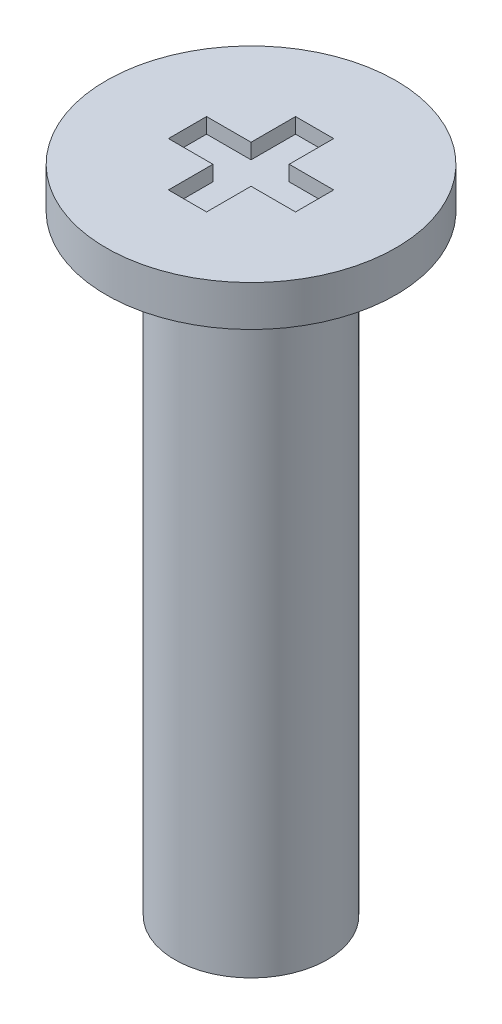
ISO-10303-21;
HEADER;
FILE_DESCRIPTION(('STEP AP214'),'2;1');
FILE_NAME('part.step','',(''),(''),'','','');
FILE_SCHEMA(('AUTOMOTIVE_DESIGN { 1 0 10303 214 1 1 1 1 }'));
ENDSEC;
DATA;
#1=APPLICATION_CONTEXT('core data for automotive mechanical design processes');
#2=APPLICATION_PROTOCOL_DEFINITION('international standard','automotive_design',2000,#1);
#3=PRODUCT_CONTEXT('',#1,'mechanical');
#4=PRODUCT('Part','Part','',(#3));
#5=PRODUCT_RELATED_PRODUCT_CATEGORY('part','',(#4));
#6=PRODUCT_DEFINITION_FORMATION('','',#4);
#7=PRODUCT_DEFINITION_CONTEXT('part definition',#1,'design');
#8=PRODUCT_DEFINITION('design','',#6,#7);
#9=PRODUCT_DEFINITION_SHAPE('','',#8);
#10=(LENGTH_UNIT() NAMED_UNIT(*) SI_UNIT(.MILLI.,.METRE.));
#11=(NAMED_UNIT(*) PLANE_ANGLE_UNIT() SI_UNIT($,.RADIAN.));
#12=(NAMED_UNIT(*) SI_UNIT($,.STERADIAN.) SOLID_ANGLE_UNIT());
#13=UNCERTAINTY_MEASURE_WITH_UNIT(LENGTH_MEASURE(1.E-05),#10,'distance_accuracy_value','');
#14=(GEOMETRIC_REPRESENTATION_CONTEXT(3) GLOBAL_UNCERTAINTY_ASSIGNED_CONTEXT((#13)) GLOBAL_UNIT_ASSIGNED_CONTEXT((#10,
#11,#12)) REPRESENTATION_CONTEXT('',''));
#15=CARTESIAN_POINT('',(0.,0.,0.));
#16=DIRECTION('',(0.,0.,1.));
#17=DIRECTION('',(1.,0.,0.));
#18=AXIS2_PLACEMENT_3D('',#15,#16,#17);
#19=CARTESIAN_POINT('',(0.,0.,0.));
#20=DIRECTION('',(0.,1.,0.));
#21=DIRECTION('',(0.,0.,1.));
#22=AXIS2_PLACEMENT_3D('',#19,#20,#21);
#23=PLANE('',#22);
#24=DIRECTION('',(-1.,0.,0.));
#25=VECTOR('',#24,1.);
#26=CARTESIAN_POINT('',(0.,0.,-0.375));
#27=LINE('',#26,#25);
#28=CARTESIAN_POINT('',(1.25,0.,-0.374999999999996));
#29=VERTEX_POINT('',#28);
#30=CARTESIAN_POINT('',(0.375,0.,-0.374999999999999));
#31=VERTEX_POINT('',#30);
#32=EDGE_CURVE('E222',#29,#31,#27,.T.);
#33=ORIENTED_EDGE('',*,*,#32,.F.);
#34=DIRECTION('',(0.,0.,-1.));
#35=VECTOR('',#34,1.);
#36=CARTESIAN_POINT('',(1.25,0.,-0.374999999999996));
#37=LINE('',#36,#35);
#38=CARTESIAN_POINT('',(1.25,0.,0.375000000000004));
#39=VERTEX_POINT('',#38);
#40=EDGE_CURVE('E149',#39,#29,#37,.T.);
#41=ORIENTED_EDGE('',*,*,#40,.F.);
#42=DIRECTION('',(1.,0.,0.));
#43=VECTOR('',#42,1.);
#44=CARTESIAN_POINT('',(0.,0.,0.375));
#45=LINE('',#44,#43);
#46=CARTESIAN_POINT('',(0.375,0.,0.375000000000004));
#47=VERTEX_POINT('',#46);
#48=EDGE_CURVE('E225',#47,#39,#45,.T.);
#49=ORIENTED_EDGE('',*,*,#48,.F.);
#50=DIRECTION('',(0.,0.,-1.));
#51=VECTOR('',#50,1.);
#52=CARTESIAN_POINT('',(0.375,0.,0.));
#53=LINE('',#52,#51);
#54=CARTESIAN_POINT('',(0.375,0.,1.25));
#55=VERTEX_POINT('',#54);
#56=EDGE_CURVE('E182',#55,#47,#53,.T.);
#57=ORIENTED_EDGE('',*,*,#56,.F.);
#58=DIRECTION('',(1.,0.,0.));
#59=VECTOR('',#58,1.);
#60=CARTESIAN_POINT('',(0.375,0.,1.25));
#61=LINE('',#60,#59);
#62=CARTESIAN_POINT('',(-0.375,0.,1.25));
#63=VERTEX_POINT('',#62);
#64=EDGE_CURVE('E187',#63,#55,#61,.T.);
#65=ORIENTED_EDGE('',*,*,#64,.F.);
#66=DIRECTION('',(0.,0.,1.));
#67=VECTOR('',#66,1.);
#68=CARTESIAN_POINT('',(-0.375,0.,0.));
#69=LINE('',#68,#67);
#70=CARTESIAN_POINT('',(-0.375,0.,0.374999999999996));
#71=VERTEX_POINT('',#70);
#72=EDGE_CURVE('E198',#71,#63,#69,.T.);
#73=ORIENTED_EDGE('',*,*,#72,.F.);
#74=DIRECTION('',(1.,0.,0.));
#75=VECTOR('',#74,1.);
#76=CARTESIAN_POINT('',(0.,0.,0.375));
#77=LINE('',#76,#75);
#78=CARTESIAN_POINT('',(-1.25,0.,0.374999999999987));
#79=VERTEX_POINT('',#78);
#80=EDGE_CURVE('E171',#79,#71,#77,.T.);
#81=ORIENTED_EDGE('',*,*,#80,.F.);
#82=DIRECTION('',(0.,0.,1.));
#83=VECTOR('',#82,1.);
#84=CARTESIAN_POINT('',(-1.25,0.,0.374999999999987));
#85=LINE('',#84,#83);
#86=CARTESIAN_POINT('',(-1.25,0.,-0.375000000000013));
#87=VERTEX_POINT('',#86);
#88=EDGE_CURVE('E168',#87,#79,#85,.T.);
#89=ORIENTED_EDGE('',*,*,#88,.F.);
#90=CARTESIAN_POINT('',(-0.375,0.,-0.375000000000001));
#91=VERTEX_POINT('',#90);
#92=EDGE_CURVE('E155',#91,#87,#27,.T.);
#93=ORIENTED_EDGE('',*,*,#92,.F.);
#94=DIRECTION('',(0.,0.,1.));
#95=VECTOR('',#94,1.);
#96=CARTESIAN_POINT('',(-0.375,0.,0.));
#97=LINE('',#96,#95);
#98=CARTESIAN_POINT('',(-0.375,0.,-1.25));
#99=VERTEX_POINT('',#98);
#100=EDGE_CURVE('E243',#99,#91,#97,.T.);
#101=ORIENTED_EDGE('',*,*,#100,.F.);
#102=DIRECTION('',(-1.,0.,0.));
#103=VECTOR('',#102,1.);
#104=CARTESIAN_POINT('',(-0.375,0.,-1.25));
#105=LINE('',#104,#103);
#106=CARTESIAN_POINT('',(0.375,0.,-1.25));
#107=VERTEX_POINT('',#106);
#108=EDGE_CURVE('E247',#107,#99,#105,.T.);
#109=ORIENTED_EDGE('',*,*,#108,.F.);
#110=DIRECTION('',(0.,0.,-1.));
#111=VECTOR('',#110,1.);
#112=CARTESIAN_POINT('',(0.375,0.,0.));
#113=LINE('',#112,#111);
#114=EDGE_CURVE('E74',#31,#107,#113,.T.);
#115=ORIENTED_EDGE('',*,*,#114,.F.);
#116=EDGE_LOOP('',(#33,#41,#49,#57,#65,#73,#81,#89,#93,#101,#109,#115));
#117=FACE_BOUND('',#116,.T.);
#118=CARTESIAN_POINT('',(0.,0.,0.));
#119=DIRECTION('',(0.,-1.,0.));
#120=DIRECTION('',(0.,0.,-1.));
#121=AXIS2_PLACEMENT_3D('',#118,#119,#120);
#122=CIRCLE('',#121,2.85);
#123=CARTESIAN_POINT('',(0.,0.,-2.85));
#124=VERTEX_POINT('',#123);
#125=EDGE_CURVE('E11',#124,#124,#122,.T.);
#126=ORIENTED_EDGE('',*,*,#125,.F.);
#127=EDGE_LOOP('',(#126));
#128=FACE_BOUND('',#127,.T.);
#129=ADVANCED_FACE('F45',(#117,#128),#23,.T.);
#130=CARTESIAN_POINT('',(0.,-12.8,0.));
#131=DIRECTION('',(0.,-1.,0.));
#132=DIRECTION('',(0.,0.,-1.));
#133=AXIS2_PLACEMENT_3D('',#130,#131,#132);
#134=CYLINDRICAL_SURFACE('',#133,2.85);
#135=ORIENTED_EDGE('',*,*,#125,.T.);
#136=EDGE_LOOP('',(#135));
#137=FACE_BOUND('',#136,.T.);
#138=CARTESIAN_POINT('',(0.,-0.8,0.));
#139=DIRECTION('',(0.,-1.,0.));
#140=DIRECTION('',(0.,0.,-1.));
#141=AXIS2_PLACEMENT_3D('',#138,#139,#140);
#142=CIRCLE('',#141,2.85);
#143=CARTESIAN_POINT('',(0.,-0.8,-2.85));
#144=VERTEX_POINT('',#143);
#145=EDGE_CURVE('E54',#144,#144,#142,.T.);
#146=ORIENTED_EDGE('',*,*,#145,.F.);
#147=EDGE_LOOP('',(#146));
#148=FACE_BOUND('',#147,.T.);
#149=ADVANCED_FACE('F279',(#137,#148),#134,.T.);
#150=CARTESIAN_POINT('',(2.85,-0.8,0.));
#151=DIRECTION('',(0.,-1.,0.));
#152=DIRECTION('',(0.,0.,-1.));
#153=AXIS2_PLACEMENT_3D('',#150,#151,#152);
#154=PLANE('',#153);
#155=ORIENTED_EDGE('',*,*,#145,.T.);
#156=EDGE_LOOP('',(#155));
#157=FACE_BOUND('',#156,.T.);
#158=CARTESIAN_POINT('',(0.,-0.8,0.));
#159=DIRECTION('',(0.,-1.,0.));
#160=DIRECTION('',(0.,0.,-1.));
#161=AXIS2_PLACEMENT_3D('',#158,#159,#160);
#162=CIRCLE('',#161,1.5);
#163=CARTESIAN_POINT('',(0.,-0.8,-1.5));
#164=VERTEX_POINT('',#163);
#165=EDGE_CURVE('E269',#164,#164,#162,.T.);
#166=ORIENTED_EDGE('',*,*,#165,.F.);
#167=EDGE_LOOP('',(#166));
#168=FACE_BOUND('',#167,.T.);
#169=ADVANCED_FACE('F276',(#157,#168),#154,.T.);
#170=CARTESIAN_POINT('',(0.,-12.8,0.));
#171=DIRECTION('',(0.,-1.,0.));
#172=DIRECTION('',(0.,0.,-1.));
#173=AXIS2_PLACEMENT_3D('',#170,#171,#172);
#174=CYLINDRICAL_SURFACE('',#173,1.5);
#175=ORIENTED_EDGE('',*,*,#165,.T.);
#176=EDGE_LOOP('',(#175));
#177=FACE_BOUND('',#176,.T.);
#178=CARTESIAN_POINT('',(0.,-12.8,0.));
#179=DIRECTION('',(0.,-1.,0.));
#180=DIRECTION('',(0.,0.,-1.));
#181=AXIS2_PLACEMENT_3D('',#178,#179,#180);
#182=CIRCLE('',#181,1.5);
#183=CARTESIAN_POINT('',(0.,-12.8,-1.5));
#184=VERTEX_POINT('',#183);
#185=EDGE_CURVE('E263',#184,#184,#182,.T.);
#186=ORIENTED_EDGE('',*,*,#185,.F.);
#187=EDGE_LOOP('',(#186));
#188=FACE_BOUND('',#187,.T.);
#189=ADVANCED_FACE('F286',(#177,#188),#174,.T.);
#190=CARTESIAN_POINT('',(1.5,-12.8,0.));
#191=DIRECTION('',(0.,-1.,0.));
#192=DIRECTION('',(0.,0.,-1.));
#193=AXIS2_PLACEMENT_3D('',#190,#191,#192);
#194=PLANE('',#193);
#195=ORIENTED_EDGE('',*,*,#185,.T.);
#196=EDGE_LOOP('',(#195));
#197=FACE_BOUND('',#196,.T.);
#198=ADVANCED_FACE('F292',(#197),#194,.T.);
#199=CARTESIAN_POINT('',(-0.375,-0.3,0.));
#200=DIRECTION('',(-1.,0.,0.));
#201=DIRECTION('',(0.,-1.,0.));
#202=AXIS2_PLACEMENT_3D('',#199,#200,#201);
#203=PLANE('',#202);
#204=ORIENTED_EDGE('',*,*,#100,.T.);
#205=DIRECTION('',(0.,-1.,0.));
#206=VECTOR('',#205,1.);
#207=CARTESIAN_POINT('',(-0.375,-0.3,-0.375000000000001));
#208=LINE('',#207,#206);
#209=CARTESIAN_POINT('',(-0.375,-0.3,-0.375000000000001));
#210=VERTEX_POINT('',#209);
#211=EDGE_CURVE('E240',#91,#210,#208,.T.);
#212=ORIENTED_EDGE('',*,*,#211,.T.);
#213=DIRECTION('',(0.,0.,1.));
#214=VECTOR('',#213,1.);
#215=CARTESIAN_POINT('',(-0.375,-0.3,0.));
#216=LINE('',#215,#214);
#217=CARTESIAN_POINT('',(-0.375,-0.3,-1.25));
#218=VERTEX_POINT('',#217);
#219=EDGE_CURVE('E146',#218,#210,#216,.T.);
#220=ORIENTED_EDGE('',*,*,#219,.F.);
#221=DIRECTION('',(0.,1.,0.));
#222=VECTOR('',#221,1.);
#223=CARTESIAN_POINT('',(-0.375,-0.3,-1.25));
#224=LINE('',#223,#222);
#225=EDGE_CURVE('E62',#218,#99,#224,.T.);
#226=ORIENTED_EDGE('',*,*,#225,.T.);
#227=EDGE_LOOP('',(#204,#212,#220,#226));
#228=FACE_BOUND('',#227,.T.);
#229=ADVANCED_FACE('F296',(#228),#203,.F.);
#230=CARTESIAN_POINT('',(-0.375,-0.3,-1.25));
#231=DIRECTION('',(0.,0.,-1.));
#232=DIRECTION('',(-1.,0.,0.));
#233=AXIS2_PLACEMENT_3D('',#230,#231,#232);
#234=PLANE('',#233);
#235=ORIENTED_EDGE('',*,*,#108,.T.);
#236=ORIENTED_EDGE('',*,*,#225,.F.);
#237=DIRECTION('',(-1.,0.,0.));
#238=VECTOR('',#237,1.);
#239=CARTESIAN_POINT('',(-0.375,-0.3,-1.25));
#240=LINE('',#239,#238);
#241=CARTESIAN_POINT('',(0.375,-0.3,-1.25));
#242=VERTEX_POINT('',#241);
#243=EDGE_CURVE('E250',#242,#218,#240,.T.);
#244=ORIENTED_EDGE('',*,*,#243,.F.);
#245=DIRECTION('',(0.,1.,0.));
#246=VECTOR('',#245,1.);
#247=CARTESIAN_POINT('',(0.375,-0.3,-1.25));
#248=LINE('',#247,#246);
#249=EDGE_CURVE('E253',#242,#107,#248,.T.);
#250=ORIENTED_EDGE('',*,*,#249,.T.);
#251=EDGE_LOOP('',(#235,#236,#244,#250));
#252=FACE_BOUND('',#251,.T.);
#253=ADVANCED_FACE('F300',(#252),#234,.F.);
#254=CARTESIAN_POINT('',(0.375,-0.3,0.));
#255=DIRECTION('',(1.,0.,0.));
#256=DIRECTION('',(0.,1.,0.));
#257=AXIS2_PLACEMENT_3D('',#254,#255,#256);
#258=PLANE('',#257);
#259=DIRECTION('',(0.,0.,-1.));
#260=VECTOR('',#259,1.);
#261=CARTESIAN_POINT('',(0.375,-0.3,0.));
#262=LINE('',#261,#260);
#263=CARTESIAN_POINT('',(0.375,-0.3,-0.374999999999999));
#264=VERTEX_POINT('',#263);
#265=EDGE_CURVE('E246',#264,#242,#262,.T.);
#266=ORIENTED_EDGE('',*,*,#265,.F.);
#267=DIRECTION('',(0.,1.,0.));
#268=VECTOR('',#267,1.);
#269=CARTESIAN_POINT('',(0.375,-0.3,-0.374999999999999));
#270=LINE('',#269,#268);
#271=EDGE_CURVE('E234',#264,#31,#270,.T.);
#272=ORIENTED_EDGE('',*,*,#271,.T.);
#273=ORIENTED_EDGE('',*,*,#114,.T.);
#274=ORIENTED_EDGE('',*,*,#249,.F.);
#275=EDGE_LOOP('',(#266,#272,#273,#274));
#276=FACE_BOUND('',#275,.T.);
#277=ADVANCED_FACE('F302',(#276),#258,.F.);
#278=CARTESIAN_POINT('',(0.,-0.3,0.));
#279=DIRECTION('',(0.,-1.,0.));
#280=DIRECTION('',(1.,0.,0.));
#281=AXIS2_PLACEMENT_3D('',#278,#279,#280);
#282=PLANE('',#281);
#283=DIRECTION('',(-1.,0.,0.));
#284=VECTOR('',#283,1.);
#285=CARTESIAN_POINT('',(0.,-0.3,-0.375));
#286=LINE('',#285,#284);
#287=CARTESIAN_POINT('',(1.25,-0.3,-0.374999999999996));
#288=VERTEX_POINT('',#287);
#289=EDGE_CURVE('E148',#288,#264,#286,.T.);
#290=ORIENTED_EDGE('',*,*,#289,.T.);
#291=ORIENTED_EDGE('',*,*,#265,.T.);
#292=ORIENTED_EDGE('',*,*,#243,.T.);
#293=ORIENTED_EDGE('',*,*,#219,.T.);
#294=CARTESIAN_POINT('',(-1.25,-0.3,-0.375000000000013));
#295=VERTEX_POINT('',#294);
#296=EDGE_CURVE('E82',#210,#295,#286,.T.);
#297=ORIENTED_EDGE('',*,*,#296,.T.);
#298=DIRECTION('',(0.,0.,1.));
#299=VECTOR('',#298,1.);
#300=CARTESIAN_POINT('',(-1.25,-0.3,0.374999999999987));
#301=LINE('',#300,#299);
#302=CARTESIAN_POINT('',(-1.25,-0.3,0.374999999999987));
#303=VERTEX_POINT('',#302);
#304=EDGE_CURVE('E144',#295,#303,#301,.T.);
#305=ORIENTED_EDGE('',*,*,#304,.T.);
#306=DIRECTION('',(1.,0.,0.));
#307=VECTOR('',#306,1.);
#308=CARTESIAN_POINT('',(0.,-0.3,0.375));
#309=LINE('',#308,#307);
#310=CARTESIAN_POINT('',(-0.375,-0.3,0.374999999999996));
#311=VERTEX_POINT('',#310);
#312=EDGE_CURVE('E165',#303,#311,#309,.T.);
#313=ORIENTED_EDGE('',*,*,#312,.T.);
#314=DIRECTION('',(0.,0.,1.));
#315=VECTOR('',#314,1.);
#316=CARTESIAN_POINT('',(-0.375,-0.3,0.));
#317=LINE('',#316,#315);
#318=CARTESIAN_POINT('',(-0.375,-0.3,1.25));
#319=VERTEX_POINT('',#318);
#320=EDGE_CURVE('E186',#311,#319,#317,.T.);
#321=ORIENTED_EDGE('',*,*,#320,.T.);
#322=DIRECTION('',(1.,0.,0.));
#323=VECTOR('',#322,1.);
#324=CARTESIAN_POINT('',(0.375,-0.3,1.25));
#325=LINE('',#324,#323);
#326=CARTESIAN_POINT('',(0.375,-0.3,1.25));
#327=VERTEX_POINT('',#326);
#328=EDGE_CURVE('E190',#319,#327,#325,.T.);
#329=ORIENTED_EDGE('',*,*,#328,.T.);
#330=DIRECTION('',(0.,0.,-1.));
#331=VECTOR('',#330,1.);
#332=CARTESIAN_POINT('',(0.375,-0.3,0.));
#333=LINE('',#332,#331);
#334=CARTESIAN_POINT('',(0.375,-0.3,0.375000000000004));
#335=VERTEX_POINT('',#334);
#336=EDGE_CURVE('E183',#327,#335,#333,.T.);
#337=ORIENTED_EDGE('',*,*,#336,.T.);
#338=DIRECTION('',(1.,0.,0.));
#339=VECTOR('',#338,1.);
#340=CARTESIAN_POINT('',(0.,-0.3,0.375));
#341=LINE('',#340,#339);
#342=CARTESIAN_POINT('',(1.25,-0.3,0.375000000000004));
#343=VERTEX_POINT('',#342);
#344=EDGE_CURVE('E214',#335,#343,#341,.T.);
#345=ORIENTED_EDGE('',*,*,#344,.T.);
#346=DIRECTION('',(0.,0.,-1.));
#347=VECTOR('',#346,1.);
#348=CARTESIAN_POINT('',(1.25,-0.3,-0.374999999999996));
#349=LINE('',#348,#347);
#350=EDGE_CURVE('E217',#343,#288,#349,.T.);
#351=ORIENTED_EDGE('',*,*,#350,.T.);
#352=EDGE_LOOP('',(#290,#291,#292,#293,#297,#305,#313,#321,#329,#337,#345,#351));
#353=FACE_BOUND('',#352,.T.);
#354=ADVANCED_FACE('F142',(#353),#282,.F.);
#355=CARTESIAN_POINT('',(0.,-0.3,-0.375));
#356=DIRECTION('',(0.,0.,-1.));
#357=DIRECTION('',(-1.,0.,0.));
#358=AXIS2_PLACEMENT_3D('',#355,#356,#357);
#359=PLANE('',#358);
#360=ORIENTED_EDGE('',*,*,#92,.T.);
#361=DIRECTION('',(0.,1.,0.));
#362=VECTOR('',#361,1.);
#363=CARTESIAN_POINT('',(-1.25,-0.3,-0.375000000000013));
#364=LINE('',#363,#362);
#365=EDGE_CURVE('E152',#295,#87,#364,.T.);
#366=ORIENTED_EDGE('',*,*,#365,.F.);
#367=ORIENTED_EDGE('',*,*,#296,.F.);
#368=ORIENTED_EDGE('',*,*,#211,.F.);
#369=EDGE_LOOP('',(#360,#366,#367,#368));
#370=FACE_BOUND('',#369,.T.);
#371=ADVANCED_FACE('F153',(#370),#359,.F.);
#372=ORIENTED_EDGE('',*,*,#289,.F.);
#373=DIRECTION('',(0.,1.,0.));
#374=VECTOR('',#373,1.);
#375=CARTESIAN_POINT('',(1.25,-0.3,-0.374999999999996));
#376=LINE('',#375,#374);
#377=EDGE_CURVE('E231',#288,#29,#376,.T.);
#378=ORIENTED_EDGE('',*,*,#377,.T.);
#379=ORIENTED_EDGE('',*,*,#32,.T.);
#380=ORIENTED_EDGE('',*,*,#271,.F.);
#381=EDGE_LOOP('',(#372,#378,#379,#380));
#382=FACE_BOUND('',#381,.T.);
#383=ADVANCED_FACE('F311',(#382),#359,.F.);
#384=CARTESIAN_POINT('',(1.25,-0.3,-0.374999999999996));
#385=DIRECTION('',(1.,0.,0.));
#386=DIRECTION('',(0.,0.,-1.));
#387=AXIS2_PLACEMENT_3D('',#384,#385,#386);
#388=PLANE('',#387);
#389=ORIENTED_EDGE('',*,*,#40,.T.);
#390=ORIENTED_EDGE('',*,*,#377,.F.);
#391=ORIENTED_EDGE('',*,*,#350,.F.);
#392=DIRECTION('',(0.,1.,0.));
#393=VECTOR('',#392,1.);
#394=CARTESIAN_POINT('',(1.25,-0.3,0.375000000000004));
#395=LINE('',#394,#393);
#396=EDGE_CURVE('E221',#343,#39,#395,.T.);
#397=ORIENTED_EDGE('',*,*,#396,.T.);
#398=EDGE_LOOP('',(#389,#390,#391,#397));
#399=FACE_BOUND('',#398,.T.);
#400=ADVANCED_FACE('F316',(#399),#388,.F.);
#401=CARTESIAN_POINT('',(0.,-0.3,0.375));
#402=DIRECTION('',(0.,0.,1.));
#403=DIRECTION('',(1.,0.,0.));
#404=AXIS2_PLACEMENT_3D('',#401,#402,#403);
#405=PLANE('',#404);
#406=DIRECTION('',(0.,1.,0.));
#407=VECTOR('',#406,1.);
#408=CARTESIAN_POINT('',(0.375,-0.3,0.375000000000001));
#409=LINE('',#408,#407);
#410=EDGE_CURVE('E207',#335,#47,#409,.T.);
#411=ORIENTED_EDGE('',*,*,#410,.T.);
#412=ORIENTED_EDGE('',*,*,#48,.T.);
#413=ORIENTED_EDGE('',*,*,#396,.F.);
#414=ORIENTED_EDGE('',*,*,#344,.F.);
#415=EDGE_LOOP('',(#411,#412,#413,#414));
#416=FACE_BOUND('',#415,.T.);
#417=ADVANCED_FACE('F312',(#416),#405,.F.);
#418=CARTESIAN_POINT('',(0.375,-0.3,0.));
#419=DIRECTION('',(1.,0.,0.));
#420=DIRECTION('',(0.,1.,0.));
#421=AXIS2_PLACEMENT_3D('',#418,#419,#420);
#422=PLANE('',#421);
#423=ORIENTED_EDGE('',*,*,#336,.F.);
#424=DIRECTION('',(0.,1.,0.));
#425=VECTOR('',#424,1.);
#426=CARTESIAN_POINT('',(0.375,-0.3,1.25));
#427=LINE('',#426,#425);
#428=EDGE_CURVE('E204',#327,#55,#427,.T.);
#429=ORIENTED_EDGE('',*,*,#428,.T.);
#430=ORIENTED_EDGE('',*,*,#56,.T.);
#431=ORIENTED_EDGE('',*,*,#410,.F.);
#432=EDGE_LOOP('',(#423,#429,#430,#431));
#433=FACE_BOUND('',#432,.T.);
#434=ADVANCED_FACE('F315',(#433),#422,.F.);
#435=CARTESIAN_POINT('',(0.375,-0.3,1.25));
#436=DIRECTION('',(0.,0.,1.));
#437=DIRECTION('',(1.,0.,0.));
#438=AXIS2_PLACEMENT_3D('',#435,#436,#437);
#439=PLANE('',#438);
#440=ORIENTED_EDGE('',*,*,#64,.T.);
#441=ORIENTED_EDGE('',*,*,#428,.F.);
#442=ORIENTED_EDGE('',*,*,#328,.F.);
#443=DIRECTION('',(0.,1.,0.));
#444=VECTOR('',#443,1.);
#445=CARTESIAN_POINT('',(-0.375,-0.3,1.25));
#446=LINE('',#445,#444);
#447=EDGE_CURVE('E194',#319,#63,#446,.T.);
#448=ORIENTED_EDGE('',*,*,#447,.T.);
#449=EDGE_LOOP('',(#440,#441,#442,#448));
#450=FACE_BOUND('',#449,.T.);
#451=ADVANCED_FACE('F323',(#450),#439,.F.);
#452=CARTESIAN_POINT('',(-0.375,-0.3,0.));
#453=DIRECTION('',(-1.,0.,0.));
#454=DIRECTION('',(0.,-1.,0.));
#455=AXIS2_PLACEMENT_3D('',#452,#453,#454);
#456=PLANE('',#455);
#457=DIRECTION('',(0.,1.,0.));
#458=VECTOR('',#457,1.);
#459=CARTESIAN_POINT('',(-0.375,-0.3,0.374999999999996));
#460=LINE('',#459,#458);
#461=EDGE_CURVE('E178',#311,#71,#460,.T.);
#462=ORIENTED_EDGE('',*,*,#461,.T.);
#463=ORIENTED_EDGE('',*,*,#72,.T.);
#464=ORIENTED_EDGE('',*,*,#447,.F.);
#465=ORIENTED_EDGE('',*,*,#320,.F.);
#466=EDGE_LOOP('',(#462,#463,#464,#465));
#467=FACE_BOUND('',#466,.T.);
#468=ADVANCED_FACE('F325',(#467),#456,.F.);
#469=CARTESIAN_POINT('',(0.,-0.3,0.375));
#470=DIRECTION('',(0.,0.,1.));
#471=DIRECTION('',(1.,0.,0.));
#472=AXIS2_PLACEMENT_3D('',#469,#470,#471);
#473=PLANE('',#472);
#474=ORIENTED_EDGE('',*,*,#312,.F.);
#475=DIRECTION('',(0.,1.,0.));
#476=VECTOR('',#475,1.);
#477=CARTESIAN_POINT('',(-1.25,-0.3,0.374999999999987));
#478=LINE('',#477,#476);
#479=EDGE_CURVE('E160',#303,#79,#478,.T.);
#480=ORIENTED_EDGE('',*,*,#479,.T.);
#481=ORIENTED_EDGE('',*,*,#80,.T.);
#482=ORIENTED_EDGE('',*,*,#461,.F.);
#483=EDGE_LOOP('',(#474,#480,#481,#482));
#484=FACE_BOUND('',#483,.T.);
#485=ADVANCED_FACE('F328',(#484),#473,.F.);
#486=CARTESIAN_POINT('',(-1.25,-0.3,0.374999999999987));
#487=DIRECTION('',(-1.,0.,0.));
#488=DIRECTION('',(0.,0.,1.));
#489=AXIS2_PLACEMENT_3D('',#486,#487,#488);
#490=PLANE('',#489);
#491=ORIENTED_EDGE('',*,*,#88,.T.);
#492=ORIENTED_EDGE('',*,*,#479,.F.);
#493=ORIENTED_EDGE('',*,*,#304,.F.);
#494=ORIENTED_EDGE('',*,*,#365,.T.);
#495=EDGE_LOOP('',(#491,#492,#493,#494));
#496=FACE_BOUND('',#495,.T.);
#497=ADVANCED_FACE('F162',(#496),#490,.F.);
#498=CLOSED_SHELL('',(#129,#149,#169,#189,#198,#229,#253,#277,#354,#371,#383,#400,#417,#434,
#451,#468,#485,#497));
#499=MANIFOLD_SOLID_BREP('B2',#498);
#500=ADVANCED_BREP_SHAPE_REPRESENTATION('',(#18,#499),#14);
#501=SHAPE_DEFINITION_REPRESENTATION(#9,#500);
ENDSEC;
END-ISO-10303-21;
